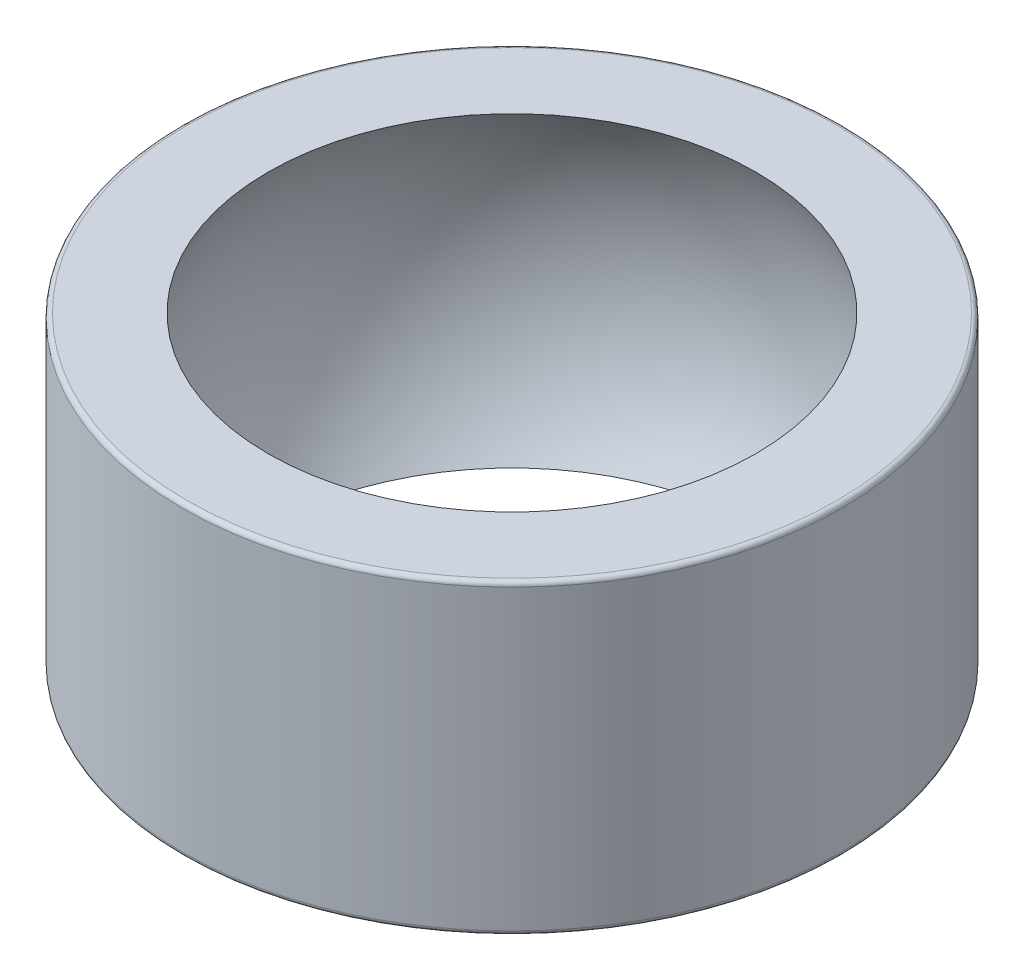
ISO-10303-21;
HEADER;
FILE_DESCRIPTION(('STEP AP214'),'2;1');
FILE_NAME('part.step','',(''),(''),'','','');
FILE_SCHEMA(('AUTOMOTIVE_DESIGN { 1 0 10303 214 1 1 1 1 }'));
ENDSEC;
DATA;
#1=APPLICATION_CONTEXT('core data for automotive mechanical design processes');
#2=APPLICATION_PROTOCOL_DEFINITION('international standard','automotive_design',2000,#1);
#3=PRODUCT_CONTEXT('',#1,'mechanical');
#4=PRODUCT('Part','Part','',(#3));
#5=PRODUCT_RELATED_PRODUCT_CATEGORY('part','',(#4));
#6=PRODUCT_DEFINITION_FORMATION('','',#4);
#7=PRODUCT_DEFINITION_CONTEXT('part definition',#1,'design');
#8=PRODUCT_DEFINITION('design','',#6,#7);
#9=PRODUCT_DEFINITION_SHAPE('','',#8);
#10=(LENGTH_UNIT() NAMED_UNIT(*) SI_UNIT(.MILLI.,.METRE.));
#11=(NAMED_UNIT(*) PLANE_ANGLE_UNIT() SI_UNIT($,.RADIAN.));
#12=(NAMED_UNIT(*) SI_UNIT($,.STERADIAN.) SOLID_ANGLE_UNIT());
#13=UNCERTAINTY_MEASURE_WITH_UNIT(LENGTH_MEASURE(1.E-05),#10,'distance_accuracy_value','');
#14=(GEOMETRIC_REPRESENTATION_CONTEXT(3) GLOBAL_UNCERTAINTY_ASSIGNED_CONTEXT((#13)) GLOBAL_UNIT_ASSIGNED_CONTEXT((#10,
#11,#12)) REPRESENTATION_CONTEXT('',''));
#15=CARTESIAN_POINT('',(0.,0.,0.));
#16=DIRECTION('',(0.,0.,1.));
#17=DIRECTION('',(1.,0.,0.));
#18=AXIS2_PLACEMENT_3D('',#15,#16,#17);
#19=CARTESIAN_POINT('',(0.,6.75,0.));
#20=DIRECTION('',(0.,-1.,0.));
#21=DIRECTION('',(0.,0.,-1.));
#22=AXIS2_PLACEMENT_3D('',#19,#20,#21);
#23=CYLINDRICAL_SURFACE('',#22,14.5);
#24=CARTESIAN_POINT('',(0.,-6.55,0.));
#25=DIRECTION('',(0.,1.,0.));
#26=DIRECTION('',(0.,0.,1.));
#27=AXIS2_PLACEMENT_3D('',#24,#25,#26);
#28=CIRCLE('',#27,14.5);
#29=CARTESIAN_POINT('',(0.,-6.55,14.5));
#30=VERTEX_POINT('',#29);
#31=EDGE_CURVE('E42',#30,#30,#28,.T.);
#32=ORIENTED_EDGE('',*,*,#31,.T.);
#33=EDGE_LOOP('',(#32));
#34=FACE_BOUND('',#33,.T.);
#35=CARTESIAN_POINT('',(0.,6.55,0.));
#36=DIRECTION('',(0.,1.,0.));
#37=DIRECTION('',(0.,0.,1.));
#38=AXIS2_PLACEMENT_3D('',#35,#36,#37);
#39=CIRCLE('',#38,14.5);
#40=CARTESIAN_POINT('',(0.,6.55,14.5));
#41=VERTEX_POINT('',#40);
#42=EDGE_CURVE('E46',#41,#41,#39,.F.);
#43=ORIENTED_EDGE('',*,*,#42,.T.);
#44=EDGE_LOOP('',(#43));
#45=FACE_BOUND('',#44,.T.);
#46=ADVANCED_FACE('F31',(#34,#45),#23,.T.);
#47=CARTESIAN_POINT('',(0.,6.75,0.));
#48=DIRECTION('',(0.,1.,0.));
#49=DIRECTION('',(0.,0.,1.));
#50=AXIS2_PLACEMENT_3D('',#47,#48,#49);
#51=PLANE('',#50);
#52=CARTESIAN_POINT('',(0.,6.75,0.));
#53=DIRECTION('',(0.,1.,0.));
#54=DIRECTION('',(0.,0.,1.));
#55=AXIS2_PLACEMENT_3D('',#52,#53,#54);
#56=CIRCLE('',#55,14.3);
#57=CARTESIAN_POINT('',(0.,6.75,14.3));
#58=VERTEX_POINT('',#57);
#59=EDGE_CURVE('E10',#58,#58,#56,.T.);
#60=ORIENTED_EDGE('',*,*,#59,.T.);
#61=EDGE_LOOP('',(#60));
#62=FACE_BOUND('',#61,.T.);
#63=CARTESIAN_POINT('',(0.,6.75,0.));
#64=DIRECTION('',(0.,1.,0.));
#65=DIRECTION('',(0.,0.,1.));
#66=AXIS2_PLACEMENT_3D('',#63,#64,#65);
#67=CIRCLE('',#66,10.7340532884833);
#68=CARTESIAN_POINT('',(-10.7340532884833,6.75,0.));
#69=VERTEX_POINT('',#68);
#70=EDGE_CURVE('E51',#69,#69,#67,.T.);
#71=ORIENTED_EDGE('',*,*,#70,.F.);
#72=EDGE_LOOP('',(#71));
#73=FACE_BOUND('',#72,.T.);
#74=ADVANCED_FACE('F61',(#62,#73),#51,.T.);
#75=CARTESIAN_POINT('',(0.,-6.75,0.));
#76=DIRECTION('',(0.,1.,0.));
#77=DIRECTION('',(0.,0.,1.));
#78=AXIS2_PLACEMENT_3D('',#75,#76,#77);
#79=PLANE('',#78);
#80=CARTESIAN_POINT('',(0.,-6.75,0.));
#81=DIRECTION('',(0.,1.,0.));
#82=DIRECTION('',(0.,0.,1.));
#83=AXIS2_PLACEMENT_3D('',#80,#81,#82);
#84=CIRCLE('',#83,14.3);
#85=CARTESIAN_POINT('',(0.,-6.75,14.3));
#86=VERTEX_POINT('',#85);
#87=EDGE_CURVE('E38',#86,#86,#84,.F.);
#88=ORIENTED_EDGE('',*,*,#87,.T.);
#89=EDGE_LOOP('',(#88));
#90=FACE_BOUND('',#89,.T.);
#91=CARTESIAN_POINT('',(0.,-6.75,0.));
#92=DIRECTION('',(0.,1.,0.));
#93=DIRECTION('',(0.,0.,1.));
#94=AXIS2_PLACEMENT_3D('',#91,#92,#93);
#95=CIRCLE('',#94,10.7340532884833);
#96=CARTESIAN_POINT('',(-10.7340532884833,-6.75,0.));
#97=VERTEX_POINT('',#96);
#98=EDGE_CURVE('E52',#97,#97,#95,.T.);
#99=ORIENTED_EDGE('',*,*,#98,.T.);
#100=EDGE_LOOP('',(#99));
#101=FACE_BOUND('',#100,.T.);
#102=ADVANCED_FACE('F63',(#90,#101),#79,.F.);
#103=CARTESIAN_POINT('',(0.,0.,0.));
#104=DIRECTION('',(0.,-1.,0.));
#105=DIRECTION('',(-1.,0.,0.));
#106=AXIS2_PLACEMENT_3D('',#103,#104,#105);
#107=SPHERICAL_SURFACE('',#106,12.68);
#108=CARTESIAN_POINT('',(-10.7340532884833,6.75,0.));
#109=CARTESIAN_POINT('',(-10.8129949360555,6.62446677342057,0.));
#110=CARTESIAN_POINT('',(-10.8897324753273,6.4975475983344,0.));
#111=CARTESIAN_POINT('',(-11.0387092543065,6.24109610145009,0.));
#112=CARTESIAN_POINT('',(-11.1109484940139,6.11156377965196,0.));
#113=CARTESIAN_POINT('',(-11.2508385909012,5.85004473964527,0.));
#114=CARTESIAN_POINT('',(-11.318489448081,5.71805802143671,0.));
#115=CARTESIAN_POINT('',(-11.4491198279051,5.45179282161535,0.));
#116=CARTESIAN_POINT('',(-11.5120993505494,5.31751434000256,0.));
#117=CARTESIAN_POINT('',(-11.6333094613236,5.0468308361902,0.));
#118=CARTESIAN_POINT('',(-11.6915400494535,4.91042581399064,0.));
#119=CARTESIAN_POINT('',(-11.8031806427793,4.63565713106938,0.));
#120=CARTESIAN_POINT('',(-11.8565906479751,4.49729347034768,0.));
#121=CARTESIAN_POINT('',(-11.9585243317063,4.21877780658402,0.));
#122=CARTESIAN_POINT('',(-12.0070480102417,4.07862580354206,0.));
#123=CARTESIAN_POINT('',(-12.0991493187241,3.79670595689601,0.));
#124=CARTESIAN_POINT('',(-12.1427269486711,3.65493811329193,0.));
#125=CARTESIAN_POINT('',(-12.2248825236578,3.36996107488597,0.));
#126=CARTESIAN_POINT('',(-12.2634604686975,3.22675188008411,0.));
#127=CARTESIAN_POINT('',(-12.3355691917733,2.93906840299879,0.));
#128=CARTESIAN_POINT('',(-12.3690999698095,2.79459412071534,0.));
#129=CARTESIAN_POINT('',(-12.431073088751,2.5045582893829,0.));
#130=CARTESIAN_POINT('',(-12.4595154296562,2.3589967403339,0.));
#131=CARTESIAN_POINT('',(-12.5112766671589,2.06696553443072,0.));
#132=CARTESIAN_POINT('',(-12.5345955637563,1.92049587757653,0.));
#133=CARTESIAN_POINT('',(-12.5760812114549,1.62682873272747,0.));
#134=CARTESIAN_POINT('',(-12.5942479625559,1.4796312447326,0.));
#135=CARTESIAN_POINT('',(-12.6254069594002,1.18468961009192,0.));
#136=CARTESIAN_POINT('',(-12.6383992051434,1.03694546344611,0.));
#137=CARTESIAN_POINT('',(-12.6591932002551,0.741092356827088,0.));
#138=CARTESIAN_POINT('',(-12.6669949496235,0.592983396853872,0.));
#139=CARTESIAN_POINT('',(-12.677398349496,0.296582957920437,0.));
#140=CARTESIAN_POINT('',(-12.68,0.148291478960219,0.));
#141=CARTESIAN_POINT('',(-12.68,-0.148291478960219,0.));
#142=CARTESIAN_POINT('',(-12.677398349496,-0.296582957920438,0.));
#143=CARTESIAN_POINT('',(-12.6669949496235,-0.592983396853872,0.));
#144=CARTESIAN_POINT('',(-12.6591932002551,-0.741092356827088,0.));
#145=CARTESIAN_POINT('',(-12.6383992051434,-1.03694546344611,0.));
#146=CARTESIAN_POINT('',(-12.6254069594002,-1.18468961009192,0.));
#147=CARTESIAN_POINT('',(-12.5942479625559,-1.4796312447326,0.));
#148=CARTESIAN_POINT('',(-12.5760812114549,-1.62682873272747,0.));
#149=CARTESIAN_POINT('',(-12.5345955637563,-1.92049587757653,0.));
#150=CARTESIAN_POINT('',(-12.5112766671589,-2.06696553443072,0.));
#151=CARTESIAN_POINT('',(-12.4595154296562,-2.3589967403339,0.));
#152=CARTESIAN_POINT('',(-12.431073088751,-2.5045582893829,0.));
#153=CARTESIAN_POINT('',(-12.3690999698095,-2.79459412071534,0.));
#154=CARTESIAN_POINT('',(-12.3355691917733,-2.93906840299879,0.));
#155=CARTESIAN_POINT('',(-12.2634604686975,-3.22675188008411,0.));
#156=CARTESIAN_POINT('',(-12.2248825236578,-3.36996107488597,0.));
#157=CARTESIAN_POINT('',(-12.1427269486711,-3.65493811329193,0.));
#158=CARTESIAN_POINT('',(-12.0991493187241,-3.79670595689601,0.));
#159=CARTESIAN_POINT('',(-12.0070480102417,-4.07862580354206,0.));
#160=CARTESIAN_POINT('',(-11.9585243317063,-4.21877780658402,0.));
#161=CARTESIAN_POINT('',(-11.8565906479751,-4.49729347034768,0.));
#162=CARTESIAN_POINT('',(-11.8031806427793,-4.63565713106938,0.));
#163=CARTESIAN_POINT('',(-11.6915400494535,-4.91042581399064,0.));
#164=CARTESIAN_POINT('',(-11.6333094613236,-5.0468308361902,0.));
#165=CARTESIAN_POINT('',(-11.5120993505494,-5.31751434000256,0.));
#166=CARTESIAN_POINT('',(-11.4491198279051,-5.45179282161535,0.));
#167=CARTESIAN_POINT('',(-11.318489448081,-5.71805802143671,0.));
#168=CARTESIAN_POINT('',(-11.2508385909012,-5.85004473964527,0.));
#169=CARTESIAN_POINT('',(-11.1109484940139,-6.11156377965196,0.));
#170=CARTESIAN_POINT('',(-11.0387092543065,-6.24109610145009,0.));
#171=CARTESIAN_POINT('',(-10.8897324753273,-6.4975475983344,0.));
#172=CARTESIAN_POINT('',(-10.8129949360555,-6.62446677342057,0.));
#173=CARTESIAN_POINT('',(-10.7340532884833,-6.75,0.));
#174=B_SPLINE_CURVE_WITH_KNOTS('',3,(#108,#109,#110,#111,#112,#113,#114,#115,#116,#117,#118,
#119,#120,#121,#122,#123,#124,#125,#126,#127,#128,#129,#130,#131,#132,#133,#134,#135,#136,#137,
#138,#139,#140,#141,#142,#143,#144,#145,#146,#147,#148,#149,#150,#151,#152,#153,#154,#155,#156,
#157,#158,#159,#160,#161,#162,#163,#164,#165,#166,#167,#168,#169,#170,#171,#172,#173),
.UNSPECIFIED.,.F.,.F.,(4,2,2,2,2,2,2,2,2,2,2,2,2,2,2,2,2,2,2,2,2,2,2,2,2,2,2,2,2,2,2,2,4),(0.,
0.444851623763145,0.88970324752629,1.33455487128944,1.77940649505258,2.22425811881572,
2.66910974257887,3.11396136634202,3.55881299010516,4.00366461386831,4.44851623763145,
4.8933678613946,5.33821948515774,5.78307110892089,6.22792273268403,6.67277435644718,
7.11762598021032,7.56247760397347,8.00732922773661,8.45218085149975,8.8970324752629,
9.34188409902605,9.78673572278919,10.2315873465523,10.6764389703155,11.1212905940786,
11.5661422178418,12.0109938416049,12.4558454653681,12.9006970891312,13.3455487128944,
13.7904003366575,14.2352519604206),.UNSPECIFIED.);
#175=EDGE_CURVE('BSEAM58',#69,#97,#174,.T.);
#176=ORIENTED_EDGE('',*,*,#70,.T.);
#177=ORIENTED_EDGE('',*,*,#98,.F.);
#178=ORIENTED_EDGE('',*,*,#175,.T.);
#179=ORIENTED_EDGE('',*,*,#175,.F.);
#180=EDGE_LOOP('',(#176,#178,#177,#179));
#181=FACE_BOUND('',#180,.T.);
#182=ADVANCED_FACE('F58',(#181),#107,.F.);
#183=CARTESIAN_POINT('',(0.,-6.55,0.));
#184=DIRECTION('',(0.,1.,0.));
#185=DIRECTION('',(0.,0.,1.));
#186=AXIS2_PLACEMENT_3D('',#183,#184,#185);
#187=TOROIDAL_SURFACE('',#186,14.3,0.2);
#188=ORIENTED_EDGE('',*,*,#87,.F.);
#189=EDGE_LOOP('',(#188));
#190=FACE_BOUND('',#189,.T.);
#191=ORIENTED_EDGE('',*,*,#31,.F.);
#192=EDGE_LOOP('',(#191));
#193=FACE_BOUND('',#192,.T.);
#194=ADVANCED_FACE('F73',(#190,#193),#187,.T.);
#195=CARTESIAN_POINT('',(0.,6.55,0.));
#196=DIRECTION('',(0.,1.,0.));
#197=DIRECTION('',(0.,0.,1.));
#198=AXIS2_PLACEMENT_3D('',#195,#196,#197);
#199=TOROIDAL_SURFACE('',#198,14.3,0.2);
#200=ORIENTED_EDGE('',*,*,#42,.F.);
#201=EDGE_LOOP('',(#200));
#202=FACE_BOUND('',#201,.T.);
#203=ORIENTED_EDGE('',*,*,#59,.F.);
#204=EDGE_LOOP('',(#203));
#205=FACE_BOUND('',#204,.T.);
#206=ADVANCED_FACE('F33',(#202,#205),#199,.T.);
#207=CLOSED_SHELL('',(#46,#74,#102,#182,#194,#206));
#208=MANIFOLD_SOLID_BREP('B2',#207);
#209=ADVANCED_BREP_SHAPE_REPRESENTATION('',(#18,#208),#14);
#210=SHAPE_DEFINITION_REPRESENTATION(#9,#209);
ENDSEC;
END-ISO-10303-21;
